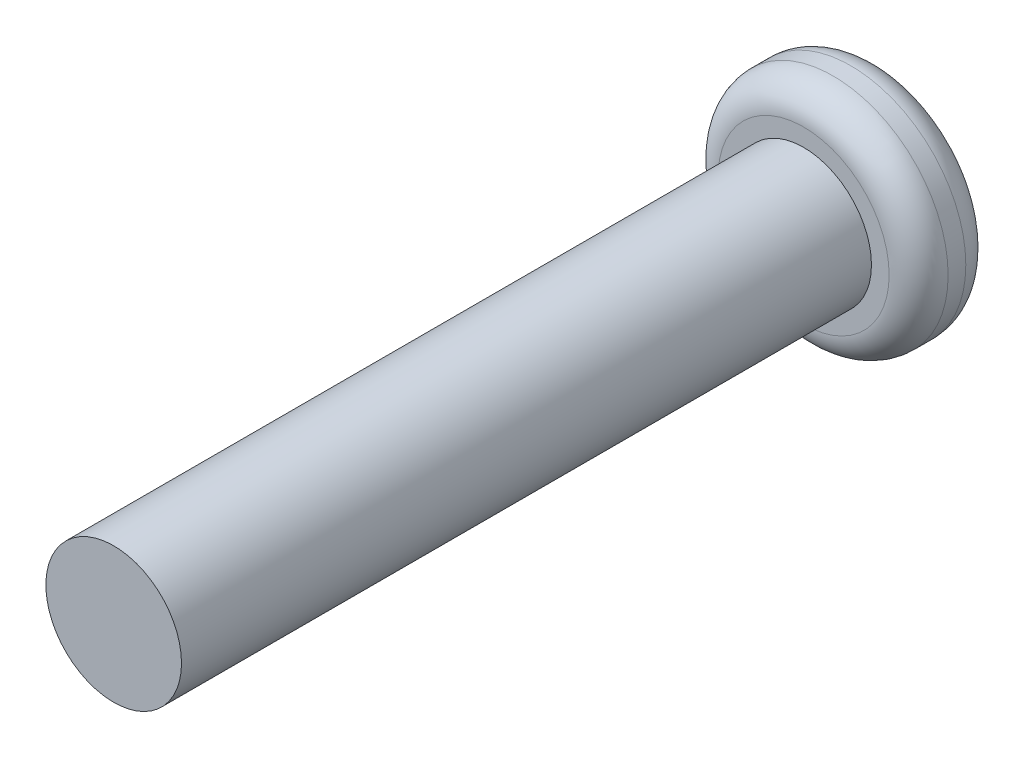
ISO-10303-21;
HEADER;
FILE_DESCRIPTION(('STEP AP214'),'2;1');
FILE_NAME('part.step','',(''),(''),'','','');
FILE_SCHEMA(('AUTOMOTIVE_DESIGN { 1 0 10303 214 1 1 1 1 }'));
ENDSEC;
DATA;
#1=APPLICATION_CONTEXT('core data for automotive mechanical design processes');
#2=APPLICATION_PROTOCOL_DEFINITION('international standard','automotive_design',2000,#1);
#3=PRODUCT_CONTEXT('',#1,'mechanical');
#4=PRODUCT('Part','Part','',(#3));
#5=PRODUCT_RELATED_PRODUCT_CATEGORY('part','',(#4));
#6=PRODUCT_DEFINITION_FORMATION('','',#4);
#7=PRODUCT_DEFINITION_CONTEXT('part definition',#1,'design');
#8=PRODUCT_DEFINITION('design','',#6,#7);
#9=PRODUCT_DEFINITION_SHAPE('','',#8);
#10=(LENGTH_UNIT() NAMED_UNIT(*) SI_UNIT(.MILLI.,.METRE.));
#11=(NAMED_UNIT(*) PLANE_ANGLE_UNIT() SI_UNIT($,.RADIAN.));
#12=(NAMED_UNIT(*) SI_UNIT($,.STERADIAN.) SOLID_ANGLE_UNIT());
#13=UNCERTAINTY_MEASURE_WITH_UNIT(LENGTH_MEASURE(1.E-05),#10,'distance_accuracy_value','');
#14=(GEOMETRIC_REPRESENTATION_CONTEXT(3) GLOBAL_UNCERTAINTY_ASSIGNED_CONTEXT((#13)) GLOBAL_UNIT_ASSIGNED_CONTEXT((#10,
#11,#12)) REPRESENTATION_CONTEXT('',''));
#15=CARTESIAN_POINT('',(0.,0.,0.));
#16=DIRECTION('',(0.,0.,1.));
#17=DIRECTION('',(1.,0.,0.));
#18=AXIS2_PLACEMENT_3D('',#15,#16,#17);
#19=CARTESIAN_POINT('',(0.,0.,1.3));
#20=DIRECTION('',(0.,0.,-1.));
#21=DIRECTION('',(-1.,0.,0.));
#22=AXIS2_PLACEMENT_3D('',#19,#20,#21);
#23=CYLINDRICAL_SURFACE('',#22,1.95);
#24=CARTESIAN_POINT('',(0.,0.,0.8));
#25=DIRECTION('',(0.,0.,1.));
#26=DIRECTION('',(1.,0.,0.));
#27=AXIS2_PLACEMENT_3D('',#24,#25,#26);
#28=CIRCLE('',#27,1.95);
#29=CARTESIAN_POINT('',(1.95,0.,0.8));
#30=VERTEX_POINT('',#29);
#31=EDGE_CURVE('E53',#30,#30,#28,.F.);
#32=ORIENTED_EDGE('',*,*,#31,.T.);
#33=EDGE_LOOP('',(#32));
#34=FACE_BOUND('',#33,.T.);
#35=CARTESIAN_POINT('',(0.,0.,0.5));
#36=DIRECTION('',(0.,0.,1.));
#37=DIRECTION('',(1.,0.,0.));
#38=AXIS2_PLACEMENT_3D('',#35,#36,#37);
#39=CIRCLE('',#38,1.95);
#40=CARTESIAN_POINT('',(1.95,0.,0.5));
#41=VERTEX_POINT('',#40);
#42=EDGE_CURVE('E408',#41,#41,#39,.T.);
#43=ORIENTED_EDGE('',*,*,#42,.T.);
#44=EDGE_LOOP('',(#43));
#45=FACE_BOUND('',#44,.T.);
#46=ADVANCED_FACE('F44',(#34,#45),#23,.T.);
#47=CARTESIAN_POINT('',(0.,0.,1.3));
#48=DIRECTION('',(0.,0.,1.));
#49=DIRECTION('',(1.,0.,0.));
#50=AXIS2_PLACEMENT_3D('',#47,#48,#49);
#51=PLANE('',#50);
#52=CARTESIAN_POINT('',(0.,0.,1.3));
#53=DIRECTION('',(0.,0.,1.));
#54=DIRECTION('',(1.,0.,0.));
#55=AXIS2_PLACEMENT_3D('',#52,#53,#54);
#56=CIRCLE('',#55,1.45);
#57=CARTESIAN_POINT('',(1.45,0.,1.3));
#58=VERTEX_POINT('',#57);
#59=EDGE_CURVE('E404',#58,#58,#56,.T.);
#60=ORIENTED_EDGE('',*,*,#59,.T.);
#61=EDGE_LOOP('',(#60));
#62=FACE_BOUND('',#61,.T.);
#63=CARTESIAN_POINT('',(0.,0.,1.3));
#64=DIRECTION('',(0.,0.,1.));
#65=DIRECTION('',(1.,0.,0.));
#66=AXIS2_PLACEMENT_3D('',#63,#64,#65);
#67=CIRCLE('',#66,1.15);
#68=CARTESIAN_POINT('',(1.15,0.,1.3));
#69=VERTEX_POINT('',#68);
#70=EDGE_CURVE('E340',#69,#69,#67,.T.);
#71=ORIENTED_EDGE('',*,*,#70,.F.);
#72=EDGE_LOOP('',(#71));
#73=FACE_BOUND('',#72,.T.);
#74=ADVANCED_FACE('F423',(#62,#73),#51,.T.);
#75=CARTESIAN_POINT('',(0.,0.,0.));
#76=DIRECTION('',(0.,0.,1.));
#77=DIRECTION('',(1.,0.,0.));
#78=AXIS2_PLACEMENT_3D('',#75,#76,#77);
#79=PLANE('',#78);
#80=CARTESIAN_POINT('',(0.,0.,0.));
#81=DIRECTION('',(0.,0.,1.));
#82=DIRECTION('',(1.,0.,0.));
#83=AXIS2_PLACEMENT_3D('',#80,#81,#82);
#84=CIRCLE('',#83,1.45);
#85=CARTESIAN_POINT('',(1.45,0.,0.));
#86=VERTEX_POINT('',#85);
#87=EDGE_CURVE('E11',#86,#86,#84,.F.);
#88=ORIENTED_EDGE('',*,*,#87,.T.);
#89=EDGE_LOOP('',(#88));
#90=FACE_BOUND('',#89,.T.);
#91=DIRECTION('',(1.,0.,0.));
#92=VECTOR('',#91,1.);
#93=CARTESIAN_POINT('',(0.550000000000001,0.35,0.));
#94=LINE('',#93,#92);
#95=CARTESIAN_POINT('',(0.550000000000001,0.35,0.));
#96=VERTEX_POINT('',#95);
#97=CARTESIAN_POINT('',(1.05,0.35,0.));
#98=VERTEX_POINT('',#97);
#99=EDGE_CURVE('E248',#96,#98,#94,.T.);
#100=ORIENTED_EDGE('',*,*,#99,.F.);
#101=CARTESIAN_POINT('',(0.55,0.55,0.));
#102=DIRECTION('',(0.,0.,1.));
#103=DIRECTION('',(-1.,0.,0.));
#104=AXIS2_PLACEMENT_3D('',#101,#102,#103);
#105=CIRCLE('',#104,0.2);
#106=CARTESIAN_POINT('',(0.35,0.550000000000002,0.));
#107=VERTEX_POINT('',#106);
#108=EDGE_CURVE('E60',#107,#96,#105,.T.);
#109=ORIENTED_EDGE('',*,*,#108,.F.);
#110=DIRECTION('',(0.,-1.,0.));
#111=VECTOR('',#110,1.);
#112=CARTESIAN_POINT('',(0.35,1.05,0.));
#113=LINE('',#112,#111);
#114=CARTESIAN_POINT('',(0.35,1.05,0.));
#115=VERTEX_POINT('',#114);
#116=EDGE_CURVE('E334',#115,#107,#113,.T.);
#117=ORIENTED_EDGE('',*,*,#116,.F.);
#118=CARTESIAN_POINT('',(0.15,1.05,0.));
#119=DIRECTION('',(0.,0.,-1.));
#120=DIRECTION('',(1.,0.,0.));
#121=AXIS2_PLACEMENT_3D('',#118,#119,#120);
#122=CIRCLE('',#121,0.2);
#123=CARTESIAN_POINT('',(0.149999999999999,1.25,0.));
#124=VERTEX_POINT('',#123);
#125=EDGE_CURVE('E331',#124,#115,#122,.T.);
#126=ORIENTED_EDGE('',*,*,#125,.F.);
#127=DIRECTION('',(1.,0.,0.));
#128=VECTOR('',#127,1.);
#129=CARTESIAN_POINT('',(0.149999999999999,1.25,0.));
#130=LINE('',#129,#128);
#131=CARTESIAN_POINT('',(-0.149999999999999,1.25,0.));
#132=VERTEX_POINT('',#131);
#133=EDGE_CURVE('E216',#132,#124,#130,.T.);
#134=ORIENTED_EDGE('',*,*,#133,.F.);
#135=CARTESIAN_POINT('',(-0.15,1.05,0.));
#136=DIRECTION('',(0.,0.,-1.));
#137=DIRECTION('',(1.,0.,0.));
#138=AXIS2_PLACEMENT_3D('',#135,#136,#137);
#139=CIRCLE('',#138,0.2);
#140=CARTESIAN_POINT('',(-0.35,1.05,0.));
#141=VERTEX_POINT('',#140);
#142=EDGE_CURVE('E325',#141,#132,#139,.T.);
#143=ORIENTED_EDGE('',*,*,#142,.F.);
#144=DIRECTION('',(0.,1.,0.));
#145=VECTOR('',#144,1.);
#146=CARTESIAN_POINT('',(-0.35,1.05,0.));
#147=LINE('',#146,#145);
#148=CARTESIAN_POINT('',(-0.35,0.550000000000002,0.));
#149=VERTEX_POINT('',#148);
#150=EDGE_CURVE('E321',#149,#141,#147,.T.);
#151=ORIENTED_EDGE('',*,*,#150,.F.);
#152=CARTESIAN_POINT('',(-0.55,0.55,0.));
#153=DIRECTION('',(0.,0.,1.));
#154=DIRECTION('',(-1.,0.,0.));
#155=AXIS2_PLACEMENT_3D('',#152,#153,#154);
#156=CIRCLE('',#155,0.2);
#157=CARTESIAN_POINT('',(-0.550000000000001,0.35,0.));
#158=VERTEX_POINT('',#157);
#159=EDGE_CURVE('E317',#158,#149,#156,.T.);
#160=ORIENTED_EDGE('',*,*,#159,.F.);
#161=DIRECTION('',(1.,0.,0.));
#162=VECTOR('',#161,1.);
#163=CARTESIAN_POINT('',(-0.550000000000001,0.35,0.));
#164=LINE('',#163,#162);
#165=CARTESIAN_POINT('',(-1.05,0.35,0.));
#166=VERTEX_POINT('',#165);
#167=EDGE_CURVE('E313',#166,#158,#164,.T.);
#168=ORIENTED_EDGE('',*,*,#167,.F.);
#169=CARTESIAN_POINT('',(-1.05,0.15,0.));
#170=DIRECTION('',(0.,0.,-1.));
#171=DIRECTION('',(1.,0.,0.));
#172=AXIS2_PLACEMENT_3D('',#169,#170,#171);
#173=CIRCLE('',#172,0.2);
#174=CARTESIAN_POINT('',(-1.25,0.149999999999999,0.));
#175=VERTEX_POINT('',#174);
#176=EDGE_CURVE('E309',#175,#166,#173,.T.);
#177=ORIENTED_EDGE('',*,*,#176,.F.);
#178=DIRECTION('',(0.,1.,0.));
#179=VECTOR('',#178,1.);
#180=CARTESIAN_POINT('',(-1.25,0.149999999999999,0.));
#181=LINE('',#180,#179);
#182=CARTESIAN_POINT('',(-1.25,-0.15,0.));
#183=VERTEX_POINT('',#182);
#184=EDGE_CURVE('E305',#183,#175,#181,.T.);
#185=ORIENTED_EDGE('',*,*,#184,.F.);
#186=CARTESIAN_POINT('',(-1.05,-0.15,0.));
#187=DIRECTION('',(0.,0.,-1.));
#188=DIRECTION('',(-1.,0.,0.));
#189=AXIS2_PLACEMENT_3D('',#186,#187,#188);
#190=CIRCLE('',#189,0.2);
#191=CARTESIAN_POINT('',(-1.05,-0.35,0.));
#192=VERTEX_POINT('',#191);
#193=EDGE_CURVE('E301',#192,#183,#190,.T.);
#194=ORIENTED_EDGE('',*,*,#193,.F.);
#195=DIRECTION('',(-1.,0.,0.));
#196=VECTOR('',#195,1.);
#197=CARTESIAN_POINT('',(-0.550000000000001,-0.35,0.));
#198=LINE('',#197,#196);
#199=CARTESIAN_POINT('',(-0.550000000000001,-0.35,0.));
#200=VERTEX_POINT('',#199);
#201=EDGE_CURVE('E297',#200,#192,#198,.T.);
#202=ORIENTED_EDGE('',*,*,#201,.F.);
#203=CARTESIAN_POINT('',(-0.55,-0.55,0.));
#204=DIRECTION('',(0.,0.,1.));
#205=DIRECTION('',(-1.,0.,0.));
#206=AXIS2_PLACEMENT_3D('',#203,#204,#205);
#207=CIRCLE('',#206,0.2);
#208=CARTESIAN_POINT('',(-0.35,-0.550000000000002,0.));
#209=VERTEX_POINT('',#208);
#210=EDGE_CURVE('E293',#209,#200,#207,.T.);
#211=ORIENTED_EDGE('',*,*,#210,.F.);
#212=DIRECTION('',(0.,1.,0.));
#213=VECTOR('',#212,1.);
#214=CARTESIAN_POINT('',(-0.35,-1.05,0.));
#215=LINE('',#214,#213);
#216=CARTESIAN_POINT('',(-0.35,-1.05,0.));
#217=VERTEX_POINT('',#216);
#218=EDGE_CURVE('E289',#217,#209,#215,.T.);
#219=ORIENTED_EDGE('',*,*,#218,.F.);
#220=CARTESIAN_POINT('',(-0.15,-1.05,0.));
#221=DIRECTION('',(0.,0.,-1.));
#222=DIRECTION('',(1.,0.,0.));
#223=AXIS2_PLACEMENT_3D('',#220,#221,#222);
#224=CIRCLE('',#223,0.2);
#225=CARTESIAN_POINT('',(-0.149999999999999,-1.25,0.));
#226=VERTEX_POINT('',#225);
#227=EDGE_CURVE('E285',#226,#217,#224,.T.);
#228=ORIENTED_EDGE('',*,*,#227,.F.);
#229=DIRECTION('',(-1.,0.,0.));
#230=VECTOR('',#229,1.);
#231=CARTESIAN_POINT('',(0.149999999999999,-1.25,0.));
#232=LINE('',#231,#230);
#233=CARTESIAN_POINT('',(0.149999999999999,-1.25,0.));
#234=VERTEX_POINT('',#233);
#235=EDGE_CURVE('E281',#234,#226,#232,.T.);
#236=ORIENTED_EDGE('',*,*,#235,.F.);
#237=CARTESIAN_POINT('',(0.15,-1.05,0.));
#238=DIRECTION('',(0.,0.,-1.));
#239=DIRECTION('',(-1.,0.,0.));
#240=AXIS2_PLACEMENT_3D('',#237,#238,#239);
#241=CIRCLE('',#240,0.2);
#242=CARTESIAN_POINT('',(0.35,-1.05,0.));
#243=VERTEX_POINT('',#242);
#244=EDGE_CURVE('E277',#243,#234,#241,.T.);
#245=ORIENTED_EDGE('',*,*,#244,.F.);
#246=DIRECTION('',(0.,-1.,0.));
#247=VECTOR('',#246,1.);
#248=CARTESIAN_POINT('',(0.35,-1.05,0.));
#249=LINE('',#248,#247);
#250=CARTESIAN_POINT('',(0.35,-0.550000000000002,0.));
#251=VERTEX_POINT('',#250);
#252=EDGE_CURVE('E273',#251,#243,#249,.T.);
#253=ORIENTED_EDGE('',*,*,#252,.F.);
#254=CARTESIAN_POINT('',(0.55,-0.55,0.));
#255=DIRECTION('',(0.,0.,1.));
#256=DIRECTION('',(-1.,0.,0.));
#257=AXIS2_PLACEMENT_3D('',#254,#255,#256);
#258=CIRCLE('',#257,0.2);
#259=CARTESIAN_POINT('',(0.550000000000001,-0.35,0.));
#260=VERTEX_POINT('',#259);
#261=EDGE_CURVE('E269',#260,#251,#258,.T.);
#262=ORIENTED_EDGE('',*,*,#261,.F.);
#263=DIRECTION('',(-1.,0.,0.));
#264=VECTOR('',#263,1.);
#265=CARTESIAN_POINT('',(0.550000000000001,-0.35,0.));
#266=LINE('',#265,#264);
#267=CARTESIAN_POINT('',(1.05,-0.35,0.));
#268=VERTEX_POINT('',#267);
#269=EDGE_CURVE('E265',#268,#260,#266,.T.);
#270=ORIENTED_EDGE('',*,*,#269,.F.);
#271=CARTESIAN_POINT('',(1.05,-0.15,0.));
#272=DIRECTION('',(0.,0.,-1.));
#273=DIRECTION('',(1.,0.,0.));
#274=AXIS2_PLACEMENT_3D('',#271,#272,#273);
#275=CIRCLE('',#274,0.2);
#276=CARTESIAN_POINT('',(1.25,-0.149999999999999,0.));
#277=VERTEX_POINT('',#276);
#278=EDGE_CURVE('E261',#277,#268,#275,.T.);
#279=ORIENTED_EDGE('',*,*,#278,.F.);
#280=DIRECTION('',(0.,-1.,0.));
#281=VECTOR('',#280,1.);
#282=CARTESIAN_POINT('',(1.25,0.149999999999999,0.));
#283=LINE('',#282,#281);
#284=CARTESIAN_POINT('',(1.25,0.149999999999999,0.));
#285=VERTEX_POINT('',#284);
#286=EDGE_CURVE('E257',#285,#277,#283,.T.);
#287=ORIENTED_EDGE('',*,*,#286,.F.);
#288=CARTESIAN_POINT('',(1.05,0.15,0.));
#289=DIRECTION('',(0.,0.,-1.));
#290=DIRECTION('',(1.,0.,0.));
#291=AXIS2_PLACEMENT_3D('',#288,#289,#290);
#292=CIRCLE('',#291,0.2);
#293=EDGE_CURVE('E253',#98,#285,#292,.T.);
#294=ORIENTED_EDGE('',*,*,#293,.F.);
#295=EDGE_LOOP('',(#100,#109,#117,#126,#134,#143,#151,#160,#168,#177,#185,#194,#202,#211,#219,
#228,#236,#245,#253,#262,#270,#279,#287,#294));
#296=FACE_BOUND('',#295,.T.);
#297=ADVANCED_FACE('F426',(#90,#296),#79,.F.);
#298=CARTESIAN_POINT('',(0.55,0.55,1.));
#299=DIRECTION('',(0.,0.,-1.));
#300=DIRECTION('',(-1.,0.,0.));
#301=AXIS2_PLACEMENT_3D('',#298,#299,#300);
#302=CYLINDRICAL_SURFACE('',#301,0.2);
#303=ORIENTED_EDGE('',*,*,#108,.T.);
#304=DIRECTION('',(0.,0.,-1.));
#305=VECTOR('',#304,1.);
#306=CARTESIAN_POINT('',(0.550000000000001,0.35,1.));
#307=LINE('',#306,#305);
#308=CARTESIAN_POINT('',(0.550000000000001,0.35,1.));
#309=VERTEX_POINT('',#308);
#310=EDGE_CURVE('E144',#309,#96,#307,.T.);
#311=ORIENTED_EDGE('',*,*,#310,.F.);
#312=CARTESIAN_POINT('',(0.55,0.55,1.));
#313=DIRECTION('',(0.,0.,1.));
#314=DIRECTION('',(-1.,0.,0.));
#315=AXIS2_PLACEMENT_3D('',#312,#313,#314);
#316=CIRCLE('',#315,0.2);
#317=CARTESIAN_POINT('',(0.35,0.550000000000002,1.));
#318=VERTEX_POINT('',#317);
#319=EDGE_CURVE('E337',#318,#309,#316,.T.);
#320=ORIENTED_EDGE('',*,*,#319,.F.);
#321=DIRECTION('',(0.,0.,-1.));
#322=VECTOR('',#321,1.);
#323=CARTESIAN_POINT('',(0.35,0.550000000000002,1.));
#324=LINE('',#323,#322);
#325=EDGE_CURVE('E68',#318,#107,#324,.T.);
#326=ORIENTED_EDGE('',*,*,#325,.T.);
#327=EDGE_LOOP('',(#303,#311,#320,#326));
#328=FACE_BOUND('',#327,.T.);
#329=ADVANCED_FACE('F521',(#328),#302,.T.);
#330=CARTESIAN_POINT('',(0.35,1.05,1.));
#331=DIRECTION('',(1.,0.,0.));
#332=DIRECTION('',(0.,1.,0.));
#333=AXIS2_PLACEMENT_3D('',#330,#331,#332);
#334=PLANE('',#333);
#335=ORIENTED_EDGE('',*,*,#116,.T.);
#336=ORIENTED_EDGE('',*,*,#325,.F.);
#337=DIRECTION('',(0.,-1.,0.));
#338=VECTOR('',#337,1.);
#339=CARTESIAN_POINT('',(0.35,1.05,1.));
#340=LINE('',#339,#338);
#341=CARTESIAN_POINT('',(0.35,1.05,1.));
#342=VERTEX_POINT('',#341);
#343=EDGE_CURVE('E230',#342,#318,#340,.T.);
#344=ORIENTED_EDGE('',*,*,#343,.F.);
#345=DIRECTION('',(0.,0.,-1.));
#346=VECTOR('',#345,1.);
#347=CARTESIAN_POINT('',(0.35,1.05,1.));
#348=LINE('',#347,#346);
#349=EDGE_CURVE('E221',#342,#115,#348,.T.);
#350=ORIENTED_EDGE('',*,*,#349,.T.);
#351=EDGE_LOOP('',(#335,#336,#344,#350));
#352=FACE_BOUND('',#351,.T.);
#353=ADVANCED_FACE('F520',(#352),#334,.F.);
#354=CARTESIAN_POINT('',(0.15,1.05,1.));
#355=DIRECTION('',(0.,0.,-1.));
#356=DIRECTION('',(-1.,0.,0.));
#357=AXIS2_PLACEMENT_3D('',#354,#355,#356);
#358=CYLINDRICAL_SURFACE('',#357,0.2);
#359=ORIENTED_EDGE('',*,*,#125,.T.);
#360=ORIENTED_EDGE('',*,*,#349,.F.);
#361=CARTESIAN_POINT('',(0.15,1.05,1.));
#362=DIRECTION('',(0.,0.,-1.));
#363=DIRECTION('',(1.,0.,0.));
#364=AXIS2_PLACEMENT_3D('',#361,#362,#363);
#365=CIRCLE('',#364,0.2);
#366=CARTESIAN_POINT('',(0.149999999999999,1.25,1.));
#367=VERTEX_POINT('',#366);
#368=EDGE_CURVE('E225',#367,#342,#365,.T.);
#369=ORIENTED_EDGE('',*,*,#368,.F.);
#370=DIRECTION('',(0.,0.,-1.));
#371=VECTOR('',#370,1.);
#372=CARTESIAN_POINT('',(0.149999999999999,1.25,1.));
#373=LINE('',#372,#371);
#374=EDGE_CURVE('E209',#367,#124,#373,.T.);
#375=ORIENTED_EDGE('',*,*,#374,.T.);
#376=EDGE_LOOP('',(#359,#360,#369,#375));
#377=FACE_BOUND('',#376,.T.);
#378=ADVANCED_FACE('F226',(#377),#358,.F.);
#379=CARTESIAN_POINT('',(0.149999999999999,1.25,1.));
#380=DIRECTION('',(0.,1.,0.));
#381=DIRECTION('',(0.,0.,1.));
#382=AXIS2_PLACEMENT_3D('',#379,#380,#381);
#383=PLANE('',#382);
#384=ORIENTED_EDGE('',*,*,#133,.T.);
#385=ORIENTED_EDGE('',*,*,#374,.F.);
#386=DIRECTION('',(1.,0.,0.));
#387=VECTOR('',#386,1.);
#388=CARTESIAN_POINT('',(0.149999999999999,1.25,1.));
#389=LINE('',#388,#387);
#390=CARTESIAN_POINT('',(-0.149999999999999,1.25,1.));
#391=VERTEX_POINT('',#390);
#392=EDGE_CURVE('E213',#391,#367,#389,.T.);
#393=ORIENTED_EDGE('',*,*,#392,.F.);
#394=DIRECTION('',(0.,0.,-1.));
#395=VECTOR('',#394,1.);
#396=CARTESIAN_POINT('',(-0.149999999999999,1.25,1.));
#397=LINE('',#396,#395);
#398=EDGE_CURVE('E222',#391,#132,#397,.T.);
#399=ORIENTED_EDGE('',*,*,#398,.T.);
#400=EDGE_LOOP('',(#384,#385,#393,#399));
#401=FACE_BOUND('',#400,.T.);
#402=ADVANCED_FACE('F211',(#401),#383,.F.);
#403=CARTESIAN_POINT('',(-0.15,1.05,1.));
#404=DIRECTION('',(0.,0.,-1.));
#405=DIRECTION('',(-1.,0.,0.));
#406=AXIS2_PLACEMENT_3D('',#403,#404,#405);
#407=CYLINDRICAL_SURFACE('',#406,0.2);
#408=ORIENTED_EDGE('',*,*,#142,.T.);
#409=ORIENTED_EDGE('',*,*,#398,.F.);
#410=CARTESIAN_POINT('',(-0.15,1.05,1.));
#411=DIRECTION('',(0.,0.,-1.));
#412=DIRECTION('',(1.,0.,0.));
#413=AXIS2_PLACEMENT_3D('',#410,#411,#412);
#414=CIRCLE('',#413,0.2);
#415=CARTESIAN_POINT('',(-0.35,1.05,1.));
#416=VERTEX_POINT('',#415);
#417=EDGE_CURVE('E236',#416,#391,#414,.T.);
#418=ORIENTED_EDGE('',*,*,#417,.F.);
#419=DIRECTION('',(0.,0.,-1.));
#420=VECTOR('',#419,1.);
#421=CARTESIAN_POINT('',(-0.35,1.05,1.));
#422=LINE('',#421,#420);
#423=EDGE_CURVE('E345',#416,#141,#422,.T.);
#424=ORIENTED_EDGE('',*,*,#423,.T.);
#425=EDGE_LOOP('',(#408,#409,#418,#424));
#426=FACE_BOUND('',#425,.T.);
#427=ADVANCED_FACE('F516',(#426),#407,.F.);
#428=CARTESIAN_POINT('',(-0.35,1.05,1.));
#429=DIRECTION('',(-1.,0.,0.));
#430=DIRECTION('',(0.,-1.,0.));
#431=AXIS2_PLACEMENT_3D('',#428,#429,#430);
#432=PLANE('',#431);
#433=ORIENTED_EDGE('',*,*,#150,.T.);
#434=ORIENTED_EDGE('',*,*,#423,.F.);
#435=DIRECTION('',(0.,1.,0.));
#436=VECTOR('',#435,1.);
#437=CARTESIAN_POINT('',(-0.35,1.05,1.));
#438=LINE('',#437,#436);
#439=CARTESIAN_POINT('',(-0.35,0.550000000000002,1.));
#440=VERTEX_POINT('',#439);
#441=EDGE_CURVE('E240',#440,#416,#438,.T.);
#442=ORIENTED_EDGE('',*,*,#441,.F.);
#443=DIRECTION('',(0.,0.,-1.));
#444=VECTOR('',#443,1.);
#445=CARTESIAN_POINT('',(-0.35,0.550000000000002,1.));
#446=LINE('',#445,#444);
#447=EDGE_CURVE('E348',#440,#149,#446,.T.);
#448=ORIENTED_EDGE('',*,*,#447,.T.);
#449=EDGE_LOOP('',(#433,#434,#442,#448));
#450=FACE_BOUND('',#449,.T.);
#451=ADVANCED_FACE('F512',(#450),#432,.F.);
#452=CARTESIAN_POINT('',(-0.55,0.55,1.));
#453=DIRECTION('',(0.,0.,-1.));
#454=DIRECTION('',(-1.,0.,0.));
#455=AXIS2_PLACEMENT_3D('',#452,#453,#454);
#456=CYLINDRICAL_SURFACE('',#455,0.2);
#457=ORIENTED_EDGE('',*,*,#159,.T.);
#458=ORIENTED_EDGE('',*,*,#447,.F.);
#459=CARTESIAN_POINT('',(-0.55,0.55,1.));
#460=DIRECTION('',(0.,0.,1.));
#461=DIRECTION('',(-1.,0.,0.));
#462=AXIS2_PLACEMENT_3D('',#459,#460,#461);
#463=CIRCLE('',#462,0.2);
#464=CARTESIAN_POINT('',(-0.550000000000001,0.35,1.));
#465=VERTEX_POINT('',#464);
#466=EDGE_CURVE('E505',#465,#440,#463,.T.);
#467=ORIENTED_EDGE('',*,*,#466,.F.);
#468=DIRECTION('',(0.,0.,-1.));
#469=VECTOR('',#468,1.);
#470=CARTESIAN_POINT('',(-0.550000000000001,0.35,1.));
#471=LINE('',#470,#469);
#472=EDGE_CURVE('E351',#465,#158,#471,.T.);
#473=ORIENTED_EDGE('',*,*,#472,.T.);
#474=EDGE_LOOP('',(#457,#458,#467,#473));
#475=FACE_BOUND('',#474,.T.);
#476=ADVANCED_FACE('F760',(#475),#456,.T.);
#477=CARTESIAN_POINT('',(-0.550000000000001,0.35,1.));
#478=DIRECTION('',(0.,1.,0.));
#479=DIRECTION('',(-1.,0.,0.));
#480=AXIS2_PLACEMENT_3D('',#477,#478,#479);
#481=PLANE('',#480);
#482=ORIENTED_EDGE('',*,*,#167,.T.);
#483=ORIENTED_EDGE('',*,*,#472,.F.);
#484=DIRECTION('',(1.,0.,0.));
#485=VECTOR('',#484,1.);
#486=CARTESIAN_POINT('',(-0.550000000000001,0.35,1.));
#487=LINE('',#486,#485);
#488=CARTESIAN_POINT('',(-1.05,0.35,1.));
#489=VERTEX_POINT('',#488);
#490=EDGE_CURVE('E501',#489,#465,#487,.T.);
#491=ORIENTED_EDGE('',*,*,#490,.F.);
#492=DIRECTION('',(0.,0.,-1.));
#493=VECTOR('',#492,1.);
#494=CARTESIAN_POINT('',(-1.05,0.35,1.));
#495=LINE('',#494,#493);
#496=EDGE_CURVE('E354',#489,#166,#495,.T.);
#497=ORIENTED_EDGE('',*,*,#496,.T.);
#498=EDGE_LOOP('',(#482,#483,#491,#497));
#499=FACE_BOUND('',#498,.T.);
#500=ADVANCED_FACE('F750',(#499),#481,.F.);
#501=CARTESIAN_POINT('',(-1.05,0.15,1.));
#502=DIRECTION('',(0.,0.,-1.));
#503=DIRECTION('',(-1.,0.,0.));
#504=AXIS2_PLACEMENT_3D('',#501,#502,#503);
#505=CYLINDRICAL_SURFACE('',#504,0.2);
#506=ORIENTED_EDGE('',*,*,#176,.T.);
#507=ORIENTED_EDGE('',*,*,#496,.F.);
#508=CARTESIAN_POINT('',(-1.05,0.15,1.));
#509=DIRECTION('',(0.,0.,-1.));
#510=DIRECTION('',(1.,0.,0.));
#511=AXIS2_PLACEMENT_3D('',#508,#509,#510);
#512=CIRCLE('',#511,0.2);
#513=CARTESIAN_POINT('',(-1.25,0.149999999999999,1.));
#514=VERTEX_POINT('',#513);
#515=EDGE_CURVE('E497',#514,#489,#512,.T.);
#516=ORIENTED_EDGE('',*,*,#515,.F.);
#517=DIRECTION('',(0.,0.,-1.));
#518=VECTOR('',#517,1.);
#519=CARTESIAN_POINT('',(-1.25,0.149999999999999,1.));
#520=LINE('',#519,#518);
#521=EDGE_CURVE('E357',#514,#175,#520,.T.);
#522=ORIENTED_EDGE('',*,*,#521,.T.);
#523=EDGE_LOOP('',(#506,#507,#516,#522));
#524=FACE_BOUND('',#523,.T.);
#525=ADVANCED_FACE('F740',(#524),#505,.F.);
#526=CARTESIAN_POINT('',(-1.25,0.149999999999999,1.));
#527=DIRECTION('',(-1.,0.,0.));
#528=DIRECTION('',(0.,0.,1.));
#529=AXIS2_PLACEMENT_3D('',#526,#527,#528);
#530=PLANE('',#529);
#531=ORIENTED_EDGE('',*,*,#184,.T.);
#532=ORIENTED_EDGE('',*,*,#521,.F.);
#533=DIRECTION('',(0.,1.,0.));
#534=VECTOR('',#533,1.);
#535=CARTESIAN_POINT('',(-1.25,0.149999999999999,1.));
#536=LINE('',#535,#534);
#537=CARTESIAN_POINT('',(-1.25,-0.15,1.));
#538=VERTEX_POINT('',#537);
#539=EDGE_CURVE('E493',#538,#514,#536,.T.);
#540=ORIENTED_EDGE('',*,*,#539,.F.);
#541=DIRECTION('',(0.,0.,-1.));
#542=VECTOR('',#541,1.);
#543=CARTESIAN_POINT('',(-1.25,-0.15,1.));
#544=LINE('',#543,#542);
#545=EDGE_CURVE('E360',#538,#183,#544,.T.);
#546=ORIENTED_EDGE('',*,*,#545,.T.);
#547=EDGE_LOOP('',(#531,#532,#540,#546));
#548=FACE_BOUND('',#547,.T.);
#549=ADVANCED_FACE('F730',(#548),#530,.F.);
#550=CARTESIAN_POINT('',(-1.05,-0.15,1.));
#551=DIRECTION('',(0.,0.,-1.));
#552=DIRECTION('',(-1.,0.,0.));
#553=AXIS2_PLACEMENT_3D('',#550,#551,#552);
#554=CYLINDRICAL_SURFACE('',#553,0.2);
#555=ORIENTED_EDGE('',*,*,#193,.T.);
#556=ORIENTED_EDGE('',*,*,#545,.F.);
#557=CARTESIAN_POINT('',(-1.05,-0.15,1.));
#558=DIRECTION('',(0.,0.,-1.));
#559=DIRECTION('',(-1.,0.,0.));
#560=AXIS2_PLACEMENT_3D('',#557,#558,#559);
#561=CIRCLE('',#560,0.2);
#562=CARTESIAN_POINT('',(-1.05,-0.35,1.));
#563=VERTEX_POINT('',#562);
#564=EDGE_CURVE('E489',#563,#538,#561,.T.);
#565=ORIENTED_EDGE('',*,*,#564,.F.);
#566=DIRECTION('',(0.,0.,-1.));
#567=VECTOR('',#566,1.);
#568=CARTESIAN_POINT('',(-1.05,-0.35,1.));
#569=LINE('',#568,#567);
#570=EDGE_CURVE('E363',#563,#192,#569,.T.);
#571=ORIENTED_EDGE('',*,*,#570,.T.);
#572=EDGE_LOOP('',(#555,#556,#565,#571));
#573=FACE_BOUND('',#572,.T.);
#574=ADVANCED_FACE('F720',(#573),#554,.F.);
#575=CARTESIAN_POINT('',(-0.550000000000001,-0.35,1.));
#576=DIRECTION('',(0.,-1.,0.));
#577=DIRECTION('',(1.,0.,0.));
#578=AXIS2_PLACEMENT_3D('',#575,#576,#577);
#579=PLANE('',#578);
#580=ORIENTED_EDGE('',*,*,#201,.T.);
#581=ORIENTED_EDGE('',*,*,#570,.F.);
#582=DIRECTION('',(-1.,0.,0.));
#583=VECTOR('',#582,1.);
#584=CARTESIAN_POINT('',(-0.550000000000001,-0.35,1.));
#585=LINE('',#584,#583);
#586=CARTESIAN_POINT('',(-0.550000000000001,-0.35,1.));
#587=VERTEX_POINT('',#586);
#588=EDGE_CURVE('E485',#587,#563,#585,.T.);
#589=ORIENTED_EDGE('',*,*,#588,.F.);
#590=DIRECTION('',(0.,0.,-1.));
#591=VECTOR('',#590,1.);
#592=CARTESIAN_POINT('',(-0.550000000000001,-0.35,1.));
#593=LINE('',#592,#591);
#594=EDGE_CURVE('E366',#587,#200,#593,.T.);
#595=ORIENTED_EDGE('',*,*,#594,.T.);
#596=EDGE_LOOP('',(#580,#581,#589,#595));
#597=FACE_BOUND('',#596,.T.);
#598=ADVANCED_FACE('F710',(#597),#579,.F.);
#599=CARTESIAN_POINT('',(-0.55,-0.55,1.));
#600=DIRECTION('',(0.,0.,-1.));
#601=DIRECTION('',(-1.,0.,0.));
#602=AXIS2_PLACEMENT_3D('',#599,#600,#601);
#603=CYLINDRICAL_SURFACE('',#602,0.2);
#604=ORIENTED_EDGE('',*,*,#210,.T.);
#605=ORIENTED_EDGE('',*,*,#594,.F.);
#606=CARTESIAN_POINT('',(-0.55,-0.55,1.));
#607=DIRECTION('',(0.,0.,1.));
#608=DIRECTION('',(-1.,0.,0.));
#609=AXIS2_PLACEMENT_3D('',#606,#607,#608);
#610=CIRCLE('',#609,0.2);
#611=CARTESIAN_POINT('',(-0.35,-0.550000000000002,1.));
#612=VERTEX_POINT('',#611);
#613=EDGE_CURVE('E481',#612,#587,#610,.T.);
#614=ORIENTED_EDGE('',*,*,#613,.F.);
#615=DIRECTION('',(0.,0.,-1.));
#616=VECTOR('',#615,1.);
#617=CARTESIAN_POINT('',(-0.35,-0.550000000000002,1.));
#618=LINE('',#617,#616);
#619=EDGE_CURVE('E369',#612,#209,#618,.T.);
#620=ORIENTED_EDGE('',*,*,#619,.T.);
#621=EDGE_LOOP('',(#604,#605,#614,#620));
#622=FACE_BOUND('',#621,.T.);
#623=ADVANCED_FACE('F700',(#622),#603,.T.);
#624=CARTESIAN_POINT('',(-0.35,-1.05,1.));
#625=DIRECTION('',(-1.,0.,0.));
#626=DIRECTION('',(0.,-1.,0.));
#627=AXIS2_PLACEMENT_3D('',#624,#625,#626);
#628=PLANE('',#627);
#629=ORIENTED_EDGE('',*,*,#218,.T.);
#630=ORIENTED_EDGE('',*,*,#619,.F.);
#631=DIRECTION('',(0.,1.,0.));
#632=VECTOR('',#631,1.);
#633=CARTESIAN_POINT('',(-0.35,-1.05,1.));
#634=LINE('',#633,#632);
#635=CARTESIAN_POINT('',(-0.35,-1.05,1.));
#636=VERTEX_POINT('',#635);
#637=EDGE_CURVE('E477',#636,#612,#634,.T.);
#638=ORIENTED_EDGE('',*,*,#637,.F.);
#639=DIRECTION('',(0.,0.,-1.));
#640=VECTOR('',#639,1.);
#641=CARTESIAN_POINT('',(-0.35,-1.05,1.));
#642=LINE('',#641,#640);
#643=EDGE_CURVE('E372',#636,#217,#642,.T.);
#644=ORIENTED_EDGE('',*,*,#643,.T.);
#645=EDGE_LOOP('',(#629,#630,#638,#644));
#646=FACE_BOUND('',#645,.T.);
#647=ADVANCED_FACE('F690',(#646),#628,.F.);
#648=CARTESIAN_POINT('',(-0.15,-1.05,1.));
#649=DIRECTION('',(0.,0.,-1.));
#650=DIRECTION('',(-1.,0.,0.));
#651=AXIS2_PLACEMENT_3D('',#648,#649,#650);
#652=CYLINDRICAL_SURFACE('',#651,0.2);
#653=ORIENTED_EDGE('',*,*,#227,.T.);
#654=ORIENTED_EDGE('',*,*,#643,.F.);
#655=CARTESIAN_POINT('',(-0.15,-1.05,1.));
#656=DIRECTION('',(0.,0.,-1.));
#657=DIRECTION('',(1.,0.,0.));
#658=AXIS2_PLACEMENT_3D('',#655,#656,#657);
#659=CIRCLE('',#658,0.2);
#660=CARTESIAN_POINT('',(-0.149999999999999,-1.25,1.));
#661=VERTEX_POINT('',#660);
#662=EDGE_CURVE('E473',#661,#636,#659,.T.);
#663=ORIENTED_EDGE('',*,*,#662,.F.);
#664=DIRECTION('',(0.,0.,-1.));
#665=VECTOR('',#664,1.);
#666=CARTESIAN_POINT('',(-0.149999999999999,-1.25,1.));
#667=LINE('',#666,#665);
#668=EDGE_CURVE('E375',#661,#226,#667,.T.);
#669=ORIENTED_EDGE('',*,*,#668,.T.);
#670=EDGE_LOOP('',(#653,#654,#663,#669));
#671=FACE_BOUND('',#670,.T.);
#672=ADVANCED_FACE('F680',(#671),#652,.F.);
#673=CARTESIAN_POINT('',(0.149999999999999,-1.25,1.));
#674=DIRECTION('',(0.,-1.,0.));
#675=DIRECTION('',(0.,0.,-1.));
#676=AXIS2_PLACEMENT_3D('',#673,#674,#675);
#677=PLANE('',#676);
#678=ORIENTED_EDGE('',*,*,#235,.T.);
#679=ORIENTED_EDGE('',*,*,#668,.F.);
#680=DIRECTION('',(-1.,0.,0.));
#681=VECTOR('',#680,1.);
#682=CARTESIAN_POINT('',(0.149999999999999,-1.25,1.));
#683=LINE('',#682,#681);
#684=CARTESIAN_POINT('',(0.149999999999999,-1.25,1.));
#685=VERTEX_POINT('',#684);
#686=EDGE_CURVE('E469',#685,#661,#683,.T.);
#687=ORIENTED_EDGE('',*,*,#686,.F.);
#688=DIRECTION('',(0.,0.,-1.));
#689=VECTOR('',#688,1.);
#690=CARTESIAN_POINT('',(0.149999999999999,-1.25,1.));
#691=LINE('',#690,#689);
#692=EDGE_CURVE('E378',#685,#234,#691,.T.);
#693=ORIENTED_EDGE('',*,*,#692,.T.);
#694=EDGE_LOOP('',(#678,#679,#687,#693));
#695=FACE_BOUND('',#694,.T.);
#696=ADVANCED_FACE('F670',(#695),#677,.F.);
#697=CARTESIAN_POINT('',(0.15,-1.05,1.));
#698=DIRECTION('',(0.,0.,-1.));
#699=DIRECTION('',(-1.,0.,0.));
#700=AXIS2_PLACEMENT_3D('',#697,#698,#699);
#701=CYLINDRICAL_SURFACE('',#700,0.2);
#702=ORIENTED_EDGE('',*,*,#244,.T.);
#703=ORIENTED_EDGE('',*,*,#692,.F.);
#704=CARTESIAN_POINT('',(0.15,-1.05,1.));
#705=DIRECTION('',(0.,0.,-1.));
#706=DIRECTION('',(-1.,0.,0.));
#707=AXIS2_PLACEMENT_3D('',#704,#705,#706);
#708=CIRCLE('',#707,0.2);
#709=CARTESIAN_POINT('',(0.35,-1.05,1.));
#710=VERTEX_POINT('',#709);
#711=EDGE_CURVE('E465',#710,#685,#708,.T.);
#712=ORIENTED_EDGE('',*,*,#711,.F.);
#713=DIRECTION('',(0.,0.,-1.));
#714=VECTOR('',#713,1.);
#715=CARTESIAN_POINT('',(0.35,-1.05,1.));
#716=LINE('',#715,#714);
#717=EDGE_CURVE('E381',#710,#243,#716,.T.);
#718=ORIENTED_EDGE('',*,*,#717,.T.);
#719=EDGE_LOOP('',(#702,#703,#712,#718));
#720=FACE_BOUND('',#719,.T.);
#721=ADVANCED_FACE('F660',(#720),#701,.F.);
#722=CARTESIAN_POINT('',(0.35,-1.05,1.));
#723=DIRECTION('',(1.,0.,0.));
#724=DIRECTION('',(0.,1.,0.));
#725=AXIS2_PLACEMENT_3D('',#722,#723,#724);
#726=PLANE('',#725);
#727=ORIENTED_EDGE('',*,*,#252,.T.);
#728=ORIENTED_EDGE('',*,*,#717,.F.);
#729=DIRECTION('',(0.,-1.,0.));
#730=VECTOR('',#729,1.);
#731=CARTESIAN_POINT('',(0.35,-1.05,1.));
#732=LINE('',#731,#730);
#733=CARTESIAN_POINT('',(0.35,-0.550000000000002,1.));
#734=VERTEX_POINT('',#733);
#735=EDGE_CURVE('E461',#734,#710,#732,.T.);
#736=ORIENTED_EDGE('',*,*,#735,.F.);
#737=DIRECTION('',(0.,0.,-1.));
#738=VECTOR('',#737,1.);
#739=CARTESIAN_POINT('',(0.35,-0.550000000000002,1.));
#740=LINE('',#739,#738);
#741=EDGE_CURVE('E384',#734,#251,#740,.T.);
#742=ORIENTED_EDGE('',*,*,#741,.T.);
#743=EDGE_LOOP('',(#727,#728,#736,#742));
#744=FACE_BOUND('',#743,.T.);
#745=ADVANCED_FACE('F650',(#744),#726,.F.);
#746=CARTESIAN_POINT('',(0.55,-0.55,1.));
#747=DIRECTION('',(0.,0.,-1.));
#748=DIRECTION('',(-1.,0.,0.));
#749=AXIS2_PLACEMENT_3D('',#746,#747,#748);
#750=CYLINDRICAL_SURFACE('',#749,0.2);
#751=ORIENTED_EDGE('',*,*,#261,.T.);
#752=ORIENTED_EDGE('',*,*,#741,.F.);
#753=CARTESIAN_POINT('',(0.55,-0.55,1.));
#754=DIRECTION('',(0.,0.,1.));
#755=DIRECTION('',(-1.,0.,0.));
#756=AXIS2_PLACEMENT_3D('',#753,#754,#755);
#757=CIRCLE('',#756,0.2);
#758=CARTESIAN_POINT('',(0.550000000000001,-0.35,1.));
#759=VERTEX_POINT('',#758);
#760=EDGE_CURVE('E457',#759,#734,#757,.T.);
#761=ORIENTED_EDGE('',*,*,#760,.F.);
#762=DIRECTION('',(0.,0.,-1.));
#763=VECTOR('',#762,1.);
#764=CARTESIAN_POINT('',(0.550000000000001,-0.35,1.));
#765=LINE('',#764,#763);
#766=EDGE_CURVE('E387',#759,#260,#765,.T.);
#767=ORIENTED_EDGE('',*,*,#766,.T.);
#768=EDGE_LOOP('',(#751,#752,#761,#767));
#769=FACE_BOUND('',#768,.T.);
#770=ADVANCED_FACE('F640',(#769),#750,.T.);
#771=CARTESIAN_POINT('',(0.550000000000001,-0.35,1.));
#772=DIRECTION('',(0.,-1.,0.));
#773=DIRECTION('',(1.,0.,0.));
#774=AXIS2_PLACEMENT_3D('',#771,#772,#773);
#775=PLANE('',#774);
#776=ORIENTED_EDGE('',*,*,#269,.T.);
#777=ORIENTED_EDGE('',*,*,#766,.F.);
#778=DIRECTION('',(-1.,0.,0.));
#779=VECTOR('',#778,1.);
#780=CARTESIAN_POINT('',(0.550000000000001,-0.35,1.));
#781=LINE('',#780,#779);
#782=CARTESIAN_POINT('',(1.05,-0.35,1.));
#783=VERTEX_POINT('',#782);
#784=EDGE_CURVE('E453',#783,#759,#781,.T.);
#785=ORIENTED_EDGE('',*,*,#784,.F.);
#786=DIRECTION('',(0.,0.,-1.));
#787=VECTOR('',#786,1.);
#788=CARTESIAN_POINT('',(1.05,-0.35,1.));
#789=LINE('',#788,#787);
#790=EDGE_CURVE('E390',#783,#268,#789,.T.);
#791=ORIENTED_EDGE('',*,*,#790,.T.);
#792=EDGE_LOOP('',(#776,#777,#785,#791));
#793=FACE_BOUND('',#792,.T.);
#794=ADVANCED_FACE('F630',(#793),#775,.F.);
#795=CARTESIAN_POINT('',(1.05,-0.15,1.));
#796=DIRECTION('',(0.,0.,-1.));
#797=DIRECTION('',(-1.,0.,0.));
#798=AXIS2_PLACEMENT_3D('',#795,#796,#797);
#799=CYLINDRICAL_SURFACE('',#798,0.2);
#800=ORIENTED_EDGE('',*,*,#278,.T.);
#801=ORIENTED_EDGE('',*,*,#790,.F.);
#802=CARTESIAN_POINT('',(1.05,-0.15,1.));
#803=DIRECTION('',(0.,0.,-1.));
#804=DIRECTION('',(1.,0.,0.));
#805=AXIS2_PLACEMENT_3D('',#802,#803,#804);
#806=CIRCLE('',#805,0.2);
#807=CARTESIAN_POINT('',(1.25,-0.149999999999999,1.));
#808=VERTEX_POINT('',#807);
#809=EDGE_CURVE('E449',#808,#783,#806,.T.);
#810=ORIENTED_EDGE('',*,*,#809,.F.);
#811=DIRECTION('',(0.,0.,-1.));
#812=VECTOR('',#811,1.);
#813=CARTESIAN_POINT('',(1.25,-0.149999999999999,1.));
#814=LINE('',#813,#812);
#815=EDGE_CURVE('E393',#808,#277,#814,.T.);
#816=ORIENTED_EDGE('',*,*,#815,.T.);
#817=EDGE_LOOP('',(#800,#801,#810,#816));
#818=FACE_BOUND('',#817,.T.);
#819=ADVANCED_FACE('F620',(#818),#799,.F.);
#820=CARTESIAN_POINT('',(1.25,0.149999999999999,1.));
#821=DIRECTION('',(1.,0.,0.));
#822=DIRECTION('',(0.,0.,-1.));
#823=AXIS2_PLACEMENT_3D('',#820,#821,#822);
#824=PLANE('',#823);
#825=ORIENTED_EDGE('',*,*,#286,.T.);
#826=ORIENTED_EDGE('',*,*,#815,.F.);
#827=DIRECTION('',(0.,-1.,0.));
#828=VECTOR('',#827,1.);
#829=CARTESIAN_POINT('',(1.25,0.149999999999999,1.));
#830=LINE('',#829,#828);
#831=CARTESIAN_POINT('',(1.25,0.149999999999999,1.));
#832=VERTEX_POINT('',#831);
#833=EDGE_CURVE('E445',#832,#808,#830,.T.);
#834=ORIENTED_EDGE('',*,*,#833,.F.);
#835=DIRECTION('',(0.,0.,-1.));
#836=VECTOR('',#835,1.);
#837=CARTESIAN_POINT('',(1.25,0.149999999999999,1.));
#838=LINE('',#837,#836);
#839=EDGE_CURVE('E396',#832,#285,#838,.T.);
#840=ORIENTED_EDGE('',*,*,#839,.T.);
#841=EDGE_LOOP('',(#825,#826,#834,#840));
#842=FACE_BOUND('',#841,.T.);
#843=ADVANCED_FACE('F610',(#842),#824,.F.);
#844=CARTESIAN_POINT('',(1.05,0.15,1.));
#845=DIRECTION('',(0.,0.,-1.));
#846=DIRECTION('',(-1.,0.,0.));
#847=AXIS2_PLACEMENT_3D('',#844,#845,#846);
#848=CYLINDRICAL_SURFACE('',#847,0.2);
#849=ORIENTED_EDGE('',*,*,#293,.T.);
#850=ORIENTED_EDGE('',*,*,#839,.F.);
#851=CARTESIAN_POINT('',(1.05,0.15,1.));
#852=DIRECTION('',(0.,0.,-1.));
#853=DIRECTION('',(1.,0.,0.));
#854=AXIS2_PLACEMENT_3D('',#851,#852,#853);
#855=CIRCLE('',#854,0.2);
#856=CARTESIAN_POINT('',(1.05,0.35,1.));
#857=VERTEX_POINT('',#856);
#858=EDGE_CURVE('E441',#857,#832,#855,.T.);
#859=ORIENTED_EDGE('',*,*,#858,.F.);
#860=DIRECTION('',(0.,0.,-1.));
#861=VECTOR('',#860,1.);
#862=CARTESIAN_POINT('',(1.05,0.35,1.));
#863=LINE('',#862,#861);
#864=EDGE_CURVE('E399',#857,#98,#863,.T.);
#865=ORIENTED_EDGE('',*,*,#864,.T.);
#866=EDGE_LOOP('',(#849,#850,#859,#865));
#867=FACE_BOUND('',#866,.T.);
#868=ADVANCED_FACE('F601',(#867),#848,.F.);
#869=CARTESIAN_POINT('',(0.550000000000001,0.35,1.));
#870=DIRECTION('',(0.,1.,0.));
#871=DIRECTION('',(-1.,0.,0.));
#872=AXIS2_PLACEMENT_3D('',#869,#870,#871);
#873=PLANE('',#872);
#874=ORIENTED_EDGE('',*,*,#99,.T.);
#875=ORIENTED_EDGE('',*,*,#864,.F.);
#876=DIRECTION('',(1.,0.,0.));
#877=VECTOR('',#876,1.);
#878=CARTESIAN_POINT('',(0.550000000000001,0.35,1.));
#879=LINE('',#878,#877);
#880=EDGE_CURVE('E437',#309,#857,#879,.T.);
#881=ORIENTED_EDGE('',*,*,#880,.F.);
#882=ORIENTED_EDGE('',*,*,#310,.T.);
#883=EDGE_LOOP('',(#874,#875,#881,#882));
#884=FACE_BOUND('',#883,.T.);
#885=ADVANCED_FACE('F592',(#884),#873,.F.);
#886=CARTESIAN_POINT('',(0.55,0.55,1.));
#887=DIRECTION('',(0.,0.,-1.));
#888=DIRECTION('',(-1.,0.,0.));
#889=AXIS2_PLACEMENT_3D('',#886,#887,#888);
#890=PLANE('',#889);
#891=ORIENTED_EDGE('',*,*,#319,.T.);
#892=ORIENTED_EDGE('',*,*,#880,.T.);
#893=ORIENTED_EDGE('',*,*,#858,.T.);
#894=ORIENTED_EDGE('',*,*,#833,.T.);
#895=ORIENTED_EDGE('',*,*,#809,.T.);
#896=ORIENTED_EDGE('',*,*,#784,.T.);
#897=ORIENTED_EDGE('',*,*,#760,.T.);
#898=ORIENTED_EDGE('',*,*,#735,.T.);
#899=ORIENTED_EDGE('',*,*,#711,.T.);
#900=ORIENTED_EDGE('',*,*,#686,.T.);
#901=ORIENTED_EDGE('',*,*,#662,.T.);
#902=ORIENTED_EDGE('',*,*,#637,.T.);
#903=ORIENTED_EDGE('',*,*,#613,.T.);
#904=ORIENTED_EDGE('',*,*,#588,.T.);
#905=ORIENTED_EDGE('',*,*,#564,.T.);
#906=ORIENTED_EDGE('',*,*,#539,.T.);
#907=ORIENTED_EDGE('',*,*,#515,.T.);
#908=ORIENTED_EDGE('',*,*,#490,.T.);
#909=ORIENTED_EDGE('',*,*,#466,.T.);
#910=ORIENTED_EDGE('',*,*,#441,.T.);
#911=ORIENTED_EDGE('',*,*,#417,.T.);
#912=ORIENTED_EDGE('',*,*,#392,.T.);
#913=ORIENTED_EDGE('',*,*,#368,.T.);
#914=ORIENTED_EDGE('',*,*,#343,.T.);
#915=EDGE_LOOP('',(#891,#892,#893,#894,#895,#896,#897,#898,#899,#900,#901,#902,#903,#904,#905,
#906,#907,#908,#909,#910,#911,#912,#913,#914));
#916=FACE_BOUND('',#915,.T.);
#917=ADVANCED_FACE('F233',(#916),#890,.T.);
#918=CARTESIAN_POINT('',(0.,0.,13.));
#919=DIRECTION('',(0.,0.,-1.));
#920=DIRECTION('',(-1.,0.,0.));
#921=AXIS2_PLACEMENT_3D('',#918,#919,#920);
#922=CYLINDRICAL_SURFACE('',#921,1.15);
#923=CARTESIAN_POINT('',(0.,0.,13.));
#924=DIRECTION('',(0.,0.,1.));
#925=DIRECTION('',(1.,0.,0.));
#926=AXIS2_PLACEMENT_3D('',#923,#924,#925);
#927=CIRCLE('',#926,1.15);
#928=CARTESIAN_POINT('',(1.15,0.,13.));
#929=VERTEX_POINT('',#928);
#930=EDGE_CURVE('E249',#929,#929,#927,.T.);
#931=ORIENTED_EDGE('',*,*,#930,.F.);
#932=EDGE_LOOP('',(#931));
#933=FACE_BOUND('',#932,.T.);
#934=ORIENTED_EDGE('',*,*,#70,.T.);
#935=EDGE_LOOP('',(#934));
#936=FACE_BOUND('',#935,.T.);
#937=ADVANCED_FACE('F574',(#933,#936),#922,.T.);
#938=CARTESIAN_POINT('',(0.,0.,13.));
#939=DIRECTION('',(0.,0.,1.));
#940=DIRECTION('',(1.,0.,0.));
#941=AXIS2_PLACEMENT_3D('',#938,#939,#940);
#942=PLANE('',#941);
#943=ORIENTED_EDGE('',*,*,#930,.T.);
#944=EDGE_LOOP('',(#943));
#945=FACE_BOUND('',#944,.T.);
#946=ADVANCED_FACE('F420',(#945),#942,.T.);
#947=CARTESIAN_POINT('',(0.,0.,0.8));
#948=DIRECTION('',(0.,0.,1.));
#949=DIRECTION('',(1.,0.,0.));
#950=AXIS2_PLACEMENT_3D('',#947,#948,#949);
#951=TOROIDAL_SURFACE('',#950,1.45,0.5);
#952=ORIENTED_EDGE('',*,*,#31,.F.);
#953=EDGE_LOOP('',(#952));
#954=FACE_BOUND('',#953,.T.);
#955=ORIENTED_EDGE('',*,*,#59,.F.);
#956=EDGE_LOOP('',(#955));
#957=FACE_BOUND('',#956,.T.);
#958=ADVANCED_FACE('F417',(#954,#957),#951,.T.);
#959=CARTESIAN_POINT('',(0.,0.,0.5));
#960=DIRECTION('',(0.,0.,1.));
#961=DIRECTION('',(1.,0.,0.));
#962=AXIS2_PLACEMENT_3D('',#959,#960,#961);
#963=TOROIDAL_SURFACE('',#962,1.45,0.5);
#964=ORIENTED_EDGE('',*,*,#87,.F.);
#965=EDGE_LOOP('',(#964));
#966=FACE_BOUND('',#965,.T.);
#967=ORIENTED_EDGE('',*,*,#42,.F.);
#968=EDGE_LOOP('',(#967));
#969=FACE_BOUND('',#968,.T.);
#970=ADVANCED_FACE('F46',(#966,#969),#963,.T.);
#971=CLOSED_SHELL('',(#46,#74,#297,#329,#353,#378,#402,#427,#451,#476,#500,#525,#549,#574,#598,
#623,#647,#672,#696,#721,#745,#770,#794,#819,#843,#868,#885,#917,#937,#946,#958,#970));
#972=MANIFOLD_SOLID_BREP('B2',#971);
#973=ADVANCED_BREP_SHAPE_REPRESENTATION('',(#18,#972),#14);
#974=SHAPE_DEFINITION_REPRESENTATION(#9,#973);
ENDSEC;
END-ISO-10303-21;
